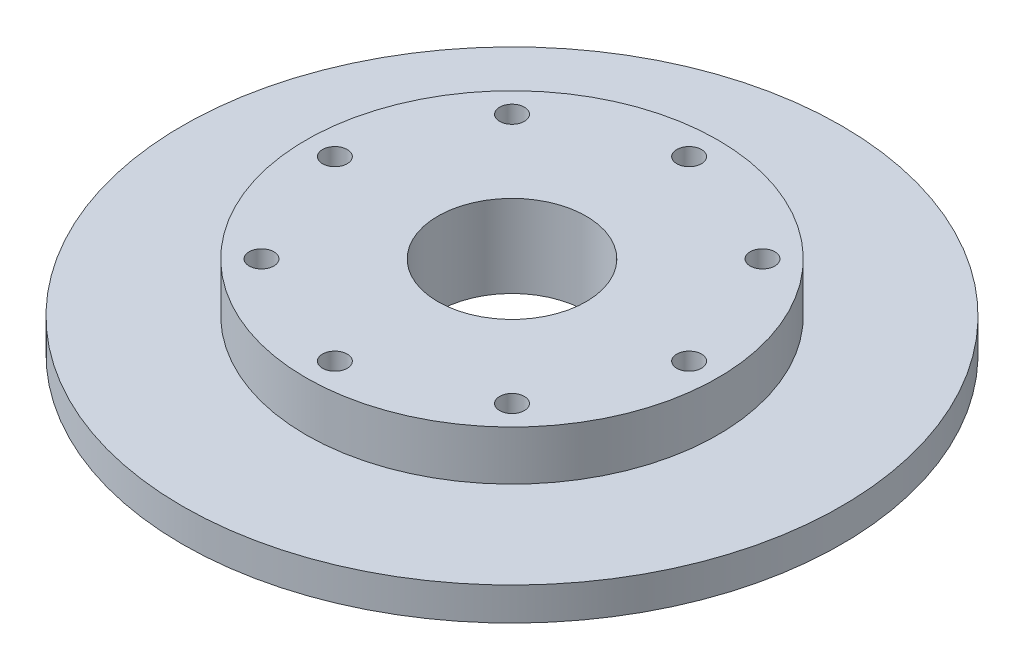
ISO-10303-21;
HEADER;
FILE_DESCRIPTION(('STEP AP214'),'2;1');
FILE_NAME('part.step','',(''),(''),'','','');
FILE_SCHEMA(('AUTOMOTIVE_DESIGN { 1 0 10303 214 1 1 1 1 }'));
ENDSEC;
DATA;
#1=APPLICATION_CONTEXT('core data for automotive mechanical design processes');
#2=APPLICATION_PROTOCOL_DEFINITION('international standard','automotive_design',2000,#1);
#3=PRODUCT_CONTEXT('',#1,'mechanical');
#4=PRODUCT('Part','Part','',(#3));
#5=PRODUCT_RELATED_PRODUCT_CATEGORY('part','',(#4));
#6=PRODUCT_DEFINITION_FORMATION('','',#4);
#7=PRODUCT_DEFINITION_CONTEXT('part definition',#1,'design');
#8=PRODUCT_DEFINITION('design','',#6,#7);
#9=PRODUCT_DEFINITION_SHAPE('','',#8);
#10=(LENGTH_UNIT() NAMED_UNIT(*) SI_UNIT(.MILLI.,.METRE.));
#11=(NAMED_UNIT(*) PLANE_ANGLE_UNIT() SI_UNIT($,.RADIAN.));
#12=(NAMED_UNIT(*) SI_UNIT($,.STERADIAN.) SOLID_ANGLE_UNIT());
#13=UNCERTAINTY_MEASURE_WITH_UNIT(LENGTH_MEASURE(1.E-05),#10,'distance_accuracy_value','');
#14=(GEOMETRIC_REPRESENTATION_CONTEXT(3) GLOBAL_UNCERTAINTY_ASSIGNED_CONTEXT((#13)) GLOBAL_UNIT_ASSIGNED_CONTEXT((#10,
#11,#12)) REPRESENTATION_CONTEXT('',''));
#15=CARTESIAN_POINT('',(0.,0.,0.));
#16=DIRECTION('',(0.,0.,1.));
#17=DIRECTION('',(1.,0.,0.));
#18=AXIS2_PLACEMENT_3D('',#15,#16,#17);
#19=CARTESIAN_POINT('',(15.2027957955109,5.,-15.2027957955106));
#20=DIRECTION('',(0.,1.,0.));
#21=DIRECTION('',(0.,0.,1.));
#22=AXIS2_PLACEMENT_3D('',#19,#20,#21);
#23=CYLINDRICAL_SURFACE('',#22,1.5);
#24=CARTESIAN_POINT('',(15.2027957955109,10.,-15.2027957955106));
#25=DIRECTION('',(0.,1.,0.));
#26=DIRECTION('',(0.,0.,1.));
#27=AXIS2_PLACEMENT_3D('',#24,#25,#26);
#28=CIRCLE('',#27,1.5);
#29=CARTESIAN_POINT('',(15.2027957955109,10.,-13.7027957955106));
#30=VERTEX_POINT('',#29);
#31=EDGE_CURVE('E133',#30,#30,#28,.T.);
#32=ORIENTED_EDGE('',*,*,#31,.T.);
#33=EDGE_LOOP('',(#32));
#34=FACE_BOUND('',#33,.T.);
#35=CARTESIAN_POINT('',(15.2027957955109,3.,-15.2027957955106));
#36=DIRECTION('',(0.,-1.,0.));
#37=DIRECTION('',(0.,0.,-1.));
#38=AXIS2_PLACEMENT_3D('',#35,#36,#37);
#39=CIRCLE('',#38,1.5);
#40=CARTESIAN_POINT('',(15.2027957955109,3.,-16.7027957955106));
#41=VERTEX_POINT('',#40);
#42=EDGE_CURVE('E43',#41,#41,#39,.F.);
#43=ORIENTED_EDGE('',*,*,#42,.F.);
#44=EDGE_LOOP('',(#43));
#45=FACE_BOUND('',#44,.T.);
#46=ADVANCED_FACE('F39',(#34,#45),#23,.F.);
#47=CARTESIAN_POINT('',(-15.2027957955108,5.,15.2027957955107));
#48=DIRECTION('',(0.,1.,0.));
#49=DIRECTION('',(0.,0.,1.));
#50=AXIS2_PLACEMENT_3D('',#47,#48,#49);
#51=CYLINDRICAL_SURFACE('',#50,1.5);
#52=CARTESIAN_POINT('',(-15.2027957955108,10.,15.2027957955107));
#53=DIRECTION('',(0.,1.,0.));
#54=DIRECTION('',(0.,0.,1.));
#55=AXIS2_PLACEMENT_3D('',#52,#53,#54);
#56=CIRCLE('',#55,1.5);
#57=CARTESIAN_POINT('',(-15.2027957955108,10.,16.7027957955107));
#58=VERTEX_POINT('',#57);
#59=EDGE_CURVE('E105',#58,#58,#56,.T.);
#60=ORIENTED_EDGE('',*,*,#59,.T.);
#61=EDGE_LOOP('',(#60));
#62=FACE_BOUND('',#61,.T.);
#63=CARTESIAN_POINT('',(-15.2027957955108,3.,15.2027957955107));
#64=DIRECTION('',(0.,-1.,0.));
#65=DIRECTION('',(0.,0.,-1.));
#66=AXIS2_PLACEMENT_3D('',#63,#64,#65);
#67=CIRCLE('',#66,1.5);
#68=CARTESIAN_POINT('',(-15.2027957955108,3.,13.7027957955107));
#69=VERTEX_POINT('',#68);
#70=EDGE_CURVE('E62',#69,#69,#67,.F.);
#71=ORIENTED_EDGE('',*,*,#70,.F.);
#72=EDGE_LOOP('',(#71));
#73=FACE_BOUND('',#72,.T.);
#74=ADVANCED_FACE('F174',(#62,#73),#51,.F.);
#75=CARTESIAN_POINT('',(0.,4.,0.));
#76=DIRECTION('',(0.,-1.,0.));
#77=DIRECTION('',(0.,0.,-1.));
#78=AXIS2_PLACEMENT_3D('',#75,#76,#77);
#79=CYLINDRICAL_SURFACE('',#78,40.);
#80=CARTESIAN_POINT('',(0.,4.,0.));
#81=DIRECTION('',(0.,1.,0.));
#82=DIRECTION('',(0.,0.,1.));
#83=AXIS2_PLACEMENT_3D('',#80,#81,#82);
#84=CIRCLE('',#83,40.);
#85=CARTESIAN_POINT('',(0.,4.,40.));
#86=VERTEX_POINT('',#85);
#87=EDGE_CURVE('E48',#86,#86,#84,.T.);
#88=ORIENTED_EDGE('',*,*,#87,.F.);
#89=EDGE_LOOP('',(#88));
#90=FACE_BOUND('',#89,.T.);
#91=CARTESIAN_POINT('',(0.,0.,0.));
#92=DIRECTION('',(0.,1.,0.));
#93=DIRECTION('',(0.,0.,1.));
#94=AXIS2_PLACEMENT_3D('',#91,#92,#93);
#95=CIRCLE('',#94,40.);
#96=CARTESIAN_POINT('',(0.,0.,40.));
#97=VERTEX_POINT('',#96);
#98=EDGE_CURVE('E54',#97,#97,#95,.T.);
#99=ORIENTED_EDGE('',*,*,#98,.T.);
#100=EDGE_LOOP('',(#99));
#101=FACE_BOUND('',#100,.T.);
#102=ADVANCED_FACE('F41',(#90,#101),#79,.T.);
#103=CARTESIAN_POINT('',(0.,4.,0.));
#104=DIRECTION('',(0.,1.,0.));
#105=DIRECTION('',(0.,0.,1.));
#106=AXIS2_PLACEMENT_3D('',#103,#104,#105);
#107=PLANE('',#106);
#108=CARTESIAN_POINT('',(0.,4.,0.));
#109=DIRECTION('',(0.,1.,0.));
#110=DIRECTION('',(0.,0.,1.));
#111=AXIS2_PLACEMENT_3D('',#108,#109,#110);
#112=CIRCLE('',#111,25.);
#113=CARTESIAN_POINT('',(0.,4.,25.));
#114=VERTEX_POINT('',#113);
#115=EDGE_CURVE('E10',#114,#114,#112,.T.);
#116=ORIENTED_EDGE('',*,*,#115,.F.);
#117=EDGE_LOOP('',(#116));
#118=FACE_BOUND('',#117,.T.);
#119=ORIENTED_EDGE('',*,*,#87,.T.);
#120=EDGE_LOOP('',(#119));
#121=FACE_BOUND('',#120,.T.);
#122=ADVANCED_FACE('F170',(#118,#121),#107,.T.);
#123=CARTESIAN_POINT('',(0.,0.,0.));
#124=DIRECTION('',(0.,1.,0.));
#125=DIRECTION('',(0.,0.,1.));
#126=AXIS2_PLACEMENT_3D('',#123,#124,#125);
#127=PLANE('',#126);
#128=CARTESIAN_POINT('',(-15.2027957955108,0.,15.2027957955107));
#129=DIRECTION('',(0.,-1.,0.));
#130=DIRECTION('',(0.,0.,-1.));
#131=AXIS2_PLACEMENT_3D('',#128,#129,#130);
#132=CIRCLE('',#131,2.84);
#133=CARTESIAN_POINT('',(-15.2027957955108,0.,12.3627957955107));
#134=VERTEX_POINT('',#133);
#135=EDGE_CURVE('E73',#134,#134,#132,.T.);
#136=ORIENTED_EDGE('',*,*,#135,.F.);
#137=EDGE_LOOP('',(#136));
#138=FACE_BOUND('',#137,.T.);
#139=CARTESIAN_POINT('',(15.2027957955109,0.,-15.2027957955106));
#140=DIRECTION('',(0.,-1.,0.));
#141=DIRECTION('',(0.,0.,-1.));
#142=AXIS2_PLACEMENT_3D('',#139,#140,#141);
#143=CIRCLE('',#142,2.84);
#144=CARTESIAN_POINT('',(15.2027957955109,0.,-18.0427957955106));
#145=VERTEX_POINT('',#144);
#146=EDGE_CURVE('E85',#145,#145,#143,.T.);
#147=ORIENTED_EDGE('',*,*,#146,.F.);
#148=EDGE_LOOP('',(#147));
#149=FACE_BOUND('',#148,.T.);
#150=CARTESIAN_POINT('',(0.,0.,0.));
#151=DIRECTION('',(0.,1.,0.));
#152=DIRECTION('',(0.,0.,1.));
#153=AXIS2_PLACEMENT_3D('',#150,#151,#152);
#154=CIRCLE('',#153,9.);
#155=CARTESIAN_POINT('',(0.,0.,9.));
#156=VERTEX_POINT('',#155);
#157=EDGE_CURVE('E89',#156,#156,#154,.T.);
#158=ORIENTED_EDGE('',*,*,#157,.T.);
#159=EDGE_LOOP('',(#158));
#160=FACE_BOUND('',#159,.T.);
#161=ORIENTED_EDGE('',*,*,#98,.F.);
#162=EDGE_LOOP('',(#161));
#163=FACE_BOUND('',#162,.T.);
#164=ADVANCED_FACE('F165',(#138,#149,#160,#163),#127,.F.);
#165=CARTESIAN_POINT('',(0.,10.,0.));
#166=DIRECTION('',(0.,-1.,0.));
#167=DIRECTION('',(0.,0.,-1.));
#168=AXIS2_PLACEMENT_3D('',#165,#166,#167);
#169=CYLINDRICAL_SURFACE('',#168,25.);
#170=CARTESIAN_POINT('',(0.,10.,0.));
#171=DIRECTION('',(0.,1.,0.));
#172=DIRECTION('',(0.,0.,1.));
#173=AXIS2_PLACEMENT_3D('',#170,#171,#172);
#174=CIRCLE('',#173,25.);
#175=CARTESIAN_POINT('',(0.,10.,25.));
#176=VERTEX_POINT('',#175);
#177=EDGE_CURVE('E57',#176,#176,#174,.T.);
#178=ORIENTED_EDGE('',*,*,#177,.F.);
#179=EDGE_LOOP('',(#178));
#180=FACE_BOUND('',#179,.T.);
#181=ORIENTED_EDGE('',*,*,#115,.T.);
#182=EDGE_LOOP('',(#181));
#183=FACE_BOUND('',#182,.T.);
#184=ADVANCED_FACE('F157',(#180,#183),#169,.T.);
#185=CARTESIAN_POINT('',(0.,10.,0.));
#186=DIRECTION('',(0.,1.,0.));
#187=DIRECTION('',(0.,0.,1.));
#188=AXIS2_PLACEMENT_3D('',#185,#186,#187);
#189=PLANE('',#188);
#190=CARTESIAN_POINT('',(0.,10.,0.));
#191=DIRECTION('',(0.,1.,0.));
#192=DIRECTION('',(0.,0.,1.));
#193=AXIS2_PLACEMENT_3D('',#190,#191,#192);
#194=CIRCLE('',#193,9.);
#195=CARTESIAN_POINT('',(0.,10.,9.));
#196=VERTEX_POINT('',#195);
#197=EDGE_CURVE('E71',#196,#196,#194,.T.);
#198=ORIENTED_EDGE('',*,*,#197,.F.);
#199=EDGE_LOOP('',(#198));
#200=FACE_BOUND('',#199,.T.);
#201=CARTESIAN_POINT('',(0.,10.,21.5));
#202=DIRECTION('',(0.,1.,0.));
#203=DIRECTION('',(0.,0.,1.));
#204=AXIS2_PLACEMENT_3D('',#201,#202,#203);
#205=CIRCLE('',#204,1.5);
#206=CARTESIAN_POINT('',(0.,10.,23.));
#207=VERTEX_POINT('',#206);
#208=EDGE_CURVE('E101',#207,#207,#205,.T.);
#209=ORIENTED_EDGE('',*,*,#208,.F.);
#210=EDGE_LOOP('',(#209));
#211=FACE_BOUND('',#210,.T.);
#212=ORIENTED_EDGE('',*,*,#59,.F.);
#213=EDGE_LOOP('',(#212));
#214=FACE_BOUND('',#213,.T.);
#215=CARTESIAN_POINT('',(-21.5,10.,0.));
#216=DIRECTION('',(0.,1.,0.));
#217=DIRECTION('',(0.,0.,1.));
#218=AXIS2_PLACEMENT_3D('',#215,#216,#217);
#219=CIRCLE('',#218,1.5);
#220=CARTESIAN_POINT('',(-21.5,10.,1.49999999999993));
#221=VERTEX_POINT('',#220);
#222=EDGE_CURVE('E113',#221,#221,#219,.T.);
#223=ORIENTED_EDGE('',*,*,#222,.F.);
#224=EDGE_LOOP('',(#223));
#225=FACE_BOUND('',#224,.T.);
#226=CARTESIAN_POINT('',(-15.2027957955107,10.,-15.2027957955108));
#227=DIRECTION('',(0.,1.,0.));
#228=DIRECTION('',(0.,0.,1.));
#229=AXIS2_PLACEMENT_3D('',#226,#227,#228);
#230=CIRCLE('',#229,1.5);
#231=CARTESIAN_POINT('',(-15.2027957955107,10.,-13.7027957955108));
#232=VERTEX_POINT('',#231);
#233=EDGE_CURVE('E121',#232,#232,#230,.T.);
#234=ORIENTED_EDGE('',*,*,#233,.F.);
#235=EDGE_LOOP('',(#234));
#236=FACE_BOUND('',#235,.T.);
#237=CARTESIAN_POINT('',(1.50133697570255E-13,10.,-21.5));
#238=DIRECTION('',(0.,1.,0.));
#239=DIRECTION('',(0.,0.,1.));
#240=AXIS2_PLACEMENT_3D('',#237,#238,#239);
#241=CIRCLE('',#240,1.5);
#242=CARTESIAN_POINT('',(1.50133697570255E-13,10.,-20.));
#243=VERTEX_POINT('',#242);
#244=EDGE_CURVE('E129',#243,#243,#241,.T.);
#245=ORIENTED_EDGE('',*,*,#244,.F.);
#246=EDGE_LOOP('',(#245));
#247=FACE_BOUND('',#246,.T.);
#248=ORIENTED_EDGE('',*,*,#31,.F.);
#249=EDGE_LOOP('',(#248));
#250=FACE_BOUND('',#249,.T.);
#251=CARTESIAN_POINT('',(21.5,10.,2.25200546355382E-13));
#252=DIRECTION('',(0.,1.,0.));
#253=DIRECTION('',(0.,0.,1.));
#254=AXIS2_PLACEMENT_3D('',#251,#252,#253);
#255=CIRCLE('',#254,1.5);
#256=CARTESIAN_POINT('',(21.5,10.,1.50000000000023));
#257=VERTEX_POINT('',#256);
#258=EDGE_CURVE('E141',#257,#257,#255,.T.);
#259=ORIENTED_EDGE('',*,*,#258,.F.);
#260=EDGE_LOOP('',(#259));
#261=FACE_BOUND('',#260,.T.);
#262=CARTESIAN_POINT('',(15.2027957955106,10.,15.202795795511));
#263=DIRECTION('',(0.,1.,0.));
#264=DIRECTION('',(0.,0.,1.));
#265=AXIS2_PLACEMENT_3D('',#262,#263,#264);
#266=CIRCLE('',#265,1.5);
#267=CARTESIAN_POINT('',(15.2027957955106,10.,16.702795795511));
#268=VERTEX_POINT('',#267);
#269=EDGE_CURVE('E93',#268,#268,#266,.T.);
#270=ORIENTED_EDGE('',*,*,#269,.F.);
#271=EDGE_LOOP('',(#270));
#272=FACE_BOUND('',#271,.T.);
#273=ORIENTED_EDGE('',*,*,#177,.T.);
#274=EDGE_LOOP('',(#273));
#275=FACE_BOUND('',#274,.T.);
#276=ADVANCED_FACE('F154',(#200,#211,#214,#225,#236,#247,#250,#261,#272,#275),#189,.T.);
#277=CARTESIAN_POINT('',(15.2027957955106,5.,15.202795795511));
#278=DIRECTION('',(0.,1.,0.));
#279=DIRECTION('',(0.,0.,1.));
#280=AXIS2_PLACEMENT_3D('',#277,#278,#279);
#281=CYLINDRICAL_SURFACE('',#280,1.5);
#282=CARTESIAN_POINT('',(15.2027957955106,5.,15.202795795511));
#283=DIRECTION('',(0.,1.,0.));
#284=DIRECTION('',(0.,0.,1.));
#285=AXIS2_PLACEMENT_3D('',#282,#283,#284);
#286=CIRCLE('',#285,1.5);
#287=CARTESIAN_POINT('',(15.2027957955106,5.,16.702795795511));
#288=VERTEX_POINT('',#287);
#289=EDGE_CURVE('E145',#288,#288,#286,.T.);
#290=ORIENTED_EDGE('',*,*,#289,.F.);
#291=EDGE_LOOP('',(#290));
#292=FACE_BOUND('',#291,.T.);
#293=ORIENTED_EDGE('',*,*,#269,.T.);
#294=EDGE_LOOP('',(#293));
#295=FACE_BOUND('',#294,.T.);
#296=ADVANCED_FACE('F152',(#292,#295),#281,.F.);
#297=CARTESIAN_POINT('',(15.2027957955106,5.,15.202795795511));
#298=DIRECTION('',(0.,1.,0.));
#299=DIRECTION('',(0.,0.,1.));
#300=AXIS2_PLACEMENT_3D('',#297,#298,#299);
#301=PLANE('',#300);
#302=ORIENTED_EDGE('',*,*,#289,.T.);
#303=EDGE_LOOP('',(#302));
#304=FACE_BOUND('',#303,.T.);
#305=ADVANCED_FACE('F194',(#304),#301,.T.);
#306=CARTESIAN_POINT('',(21.5,5.,2.25200546355382E-13));
#307=DIRECTION('',(0.,1.,0.));
#308=DIRECTION('',(0.,0.,1.));
#309=AXIS2_PLACEMENT_3D('',#306,#307,#308);
#310=CYLINDRICAL_SURFACE('',#309,1.5);
#311=CARTESIAN_POINT('',(21.5,5.,2.25200546355382E-13));
#312=DIRECTION('',(0.,1.,0.));
#313=DIRECTION('',(0.,0.,1.));
#314=AXIS2_PLACEMENT_3D('',#311,#312,#313);
#315=CIRCLE('',#314,1.5);
#316=CARTESIAN_POINT('',(21.5,5.,1.50000000000023));
#317=VERTEX_POINT('',#316);
#318=EDGE_CURVE('E137',#317,#317,#315,.T.);
#319=ORIENTED_EDGE('',*,*,#318,.F.);
#320=EDGE_LOOP('',(#319));
#321=FACE_BOUND('',#320,.T.);
#322=ORIENTED_EDGE('',*,*,#258,.T.);
#323=EDGE_LOOP('',(#322));
#324=FACE_BOUND('',#323,.T.);
#325=ADVANCED_FACE('F190',(#321,#324),#310,.F.);
#326=CARTESIAN_POINT('',(21.5,5.,2.25200546355382E-13));
#327=DIRECTION('',(0.,1.,0.));
#328=DIRECTION('',(0.,0.,1.));
#329=AXIS2_PLACEMENT_3D('',#326,#327,#328);
#330=PLANE('',#329);
#331=ORIENTED_EDGE('',*,*,#318,.T.);
#332=EDGE_LOOP('',(#331));
#333=FACE_BOUND('',#332,.T.);
#334=ADVANCED_FACE('F187',(#333),#330,.T.);
#335=CARTESIAN_POINT('',(1.50133697570255E-13,5.,-21.5));
#336=DIRECTION('',(0.,1.,0.));
#337=DIRECTION('',(0.,0.,1.));
#338=AXIS2_PLACEMENT_3D('',#335,#336,#337);
#339=CYLINDRICAL_SURFACE('',#338,1.5);
#340=CARTESIAN_POINT('',(1.50133697570255E-13,5.,-21.5));
#341=DIRECTION('',(0.,1.,0.));
#342=DIRECTION('',(0.,0.,1.));
#343=AXIS2_PLACEMENT_3D('',#340,#341,#342);
#344=CIRCLE('',#343,1.5);
#345=CARTESIAN_POINT('',(1.50133697570255E-13,5.,-20.));
#346=VERTEX_POINT('',#345);
#347=EDGE_CURVE('E125',#346,#346,#344,.T.);
#348=ORIENTED_EDGE('',*,*,#347,.F.);
#349=EDGE_LOOP('',(#348));
#350=FACE_BOUND('',#349,.T.);
#351=ORIENTED_EDGE('',*,*,#244,.T.);
#352=EDGE_LOOP('',(#351));
#353=FACE_BOUND('',#352,.T.);
#354=ADVANCED_FACE('F185',(#350,#353),#339,.F.);
#355=CARTESIAN_POINT('',(1.50133697570255E-13,5.,-21.5));
#356=DIRECTION('',(0.,1.,0.));
#357=DIRECTION('',(0.,0.,1.));
#358=AXIS2_PLACEMENT_3D('',#355,#356,#357);
#359=PLANE('',#358);
#360=ORIENTED_EDGE('',*,*,#347,.T.);
#361=EDGE_LOOP('',(#360));
#362=FACE_BOUND('',#361,.T.);
#363=ADVANCED_FACE('F224',(#362),#359,.T.);
#364=CARTESIAN_POINT('',(-15.2027957955107,5.,-15.2027957955108));
#365=DIRECTION('',(0.,1.,0.));
#366=DIRECTION('',(0.,0.,1.));
#367=AXIS2_PLACEMENT_3D('',#364,#365,#366);
#368=CYLINDRICAL_SURFACE('',#367,1.5);
#369=CARTESIAN_POINT('',(-15.2027957955107,5.,-15.2027957955108));
#370=DIRECTION('',(0.,1.,0.));
#371=DIRECTION('',(0.,0.,1.));
#372=AXIS2_PLACEMENT_3D('',#369,#370,#371);
#373=CIRCLE('',#372,1.5);
#374=CARTESIAN_POINT('',(-15.2027957955107,5.,-13.7027957955108));
#375=VERTEX_POINT('',#374);
#376=EDGE_CURVE('E117',#375,#375,#373,.T.);
#377=ORIENTED_EDGE('',*,*,#376,.F.);
#378=EDGE_LOOP('',(#377));
#379=FACE_BOUND('',#378,.T.);
#380=ORIENTED_EDGE('',*,*,#233,.T.);
#381=EDGE_LOOP('',(#380));
#382=FACE_BOUND('',#381,.T.);
#383=ADVANCED_FACE('F231',(#379,#382),#368,.F.);
#384=CARTESIAN_POINT('',(-15.2027957955107,5.,-15.2027957955108));
#385=DIRECTION('',(0.,1.,0.));
#386=DIRECTION('',(0.,0.,1.));
#387=AXIS2_PLACEMENT_3D('',#384,#385,#386);
#388=PLANE('',#387);
#389=ORIENTED_EDGE('',*,*,#376,.T.);
#390=EDGE_LOOP('',(#389));
#391=FACE_BOUND('',#390,.T.);
#392=ADVANCED_FACE('F238',(#391),#388,.T.);
#393=CARTESIAN_POINT('',(-21.5,5.,0.));
#394=DIRECTION('',(0.,1.,0.));
#395=DIRECTION('',(0.,0.,1.));
#396=AXIS2_PLACEMENT_3D('',#393,#394,#395);
#397=CYLINDRICAL_SURFACE('',#396,1.5);
#398=CARTESIAN_POINT('',(-21.5,5.,0.));
#399=DIRECTION('',(0.,1.,0.));
#400=DIRECTION('',(0.,0.,1.));
#401=AXIS2_PLACEMENT_3D('',#398,#399,#400);
#402=CIRCLE('',#401,1.5);
#403=CARTESIAN_POINT('',(-21.5,5.,1.49999999999993));
#404=VERTEX_POINT('',#403);
#405=EDGE_CURVE('E109',#404,#404,#402,.T.);
#406=ORIENTED_EDGE('',*,*,#405,.F.);
#407=EDGE_LOOP('',(#406));
#408=FACE_BOUND('',#407,.T.);
#409=ORIENTED_EDGE('',*,*,#222,.T.);
#410=EDGE_LOOP('',(#409));
#411=FACE_BOUND('',#410,.T.);
#412=ADVANCED_FACE('F246',(#408,#411),#397,.F.);
#413=CARTESIAN_POINT('',(-21.5,5.,0.));
#414=DIRECTION('',(0.,1.,0.));
#415=DIRECTION('',(0.,0.,1.));
#416=AXIS2_PLACEMENT_3D('',#413,#414,#415);
#417=PLANE('',#416);
#418=ORIENTED_EDGE('',*,*,#405,.T.);
#419=EDGE_LOOP('',(#418));
#420=FACE_BOUND('',#419,.T.);
#421=ADVANCED_FACE('F254',(#420),#417,.T.);
#422=CARTESIAN_POINT('',(0.,5.,21.5));
#423=DIRECTION('',(0.,1.,0.));
#424=DIRECTION('',(0.,0.,1.));
#425=AXIS2_PLACEMENT_3D('',#422,#423,#424);
#426=CYLINDRICAL_SURFACE('',#425,1.5);
#427=CARTESIAN_POINT('',(0.,5.,21.5));
#428=DIRECTION('',(0.,1.,0.));
#429=DIRECTION('',(0.,0.,1.));
#430=AXIS2_PLACEMENT_3D('',#427,#428,#429);
#431=CIRCLE('',#430,1.5);
#432=CARTESIAN_POINT('',(0.,5.,23.));
#433=VERTEX_POINT('',#432);
#434=EDGE_CURVE('E97',#433,#433,#431,.T.);
#435=ORIENTED_EDGE('',*,*,#434,.F.);
#436=EDGE_LOOP('',(#435));
#437=FACE_BOUND('',#436,.T.);
#438=ORIENTED_EDGE('',*,*,#208,.T.);
#439=EDGE_LOOP('',(#438));
#440=FACE_BOUND('',#439,.T.);
#441=ADVANCED_FACE('F262',(#437,#440),#426,.F.);
#442=CARTESIAN_POINT('',(0.,5.,21.5));
#443=DIRECTION('',(0.,1.,0.));
#444=DIRECTION('',(0.,0.,1.));
#445=AXIS2_PLACEMENT_3D('',#442,#443,#444);
#446=PLANE('',#445);
#447=ORIENTED_EDGE('',*,*,#434,.T.);
#448=EDGE_LOOP('',(#447));
#449=FACE_BOUND('',#448,.T.);
#450=ADVANCED_FACE('F270',(#449),#446,.T.);
#451=CARTESIAN_POINT('',(0.,0.,0.));
#452=DIRECTION('',(0.,1.,0.));
#453=DIRECTION('',(0.,0.,1.));
#454=AXIS2_PLACEMENT_3D('',#451,#452,#453);
#455=CYLINDRICAL_SURFACE('',#454,9.);
#456=ORIENTED_EDGE('',*,*,#157,.F.);
#457=EDGE_LOOP('',(#456));
#458=FACE_BOUND('',#457,.T.);
#459=ORIENTED_EDGE('',*,*,#197,.T.);
#460=EDGE_LOOP('',(#459));
#461=FACE_BOUND('',#460,.T.);
#462=ADVANCED_FACE('F278',(#458,#461),#455,.F.);
#463=CARTESIAN_POINT('',(-15.2027957955108,3.,15.2027957955107));
#464=DIRECTION('',(0.,-1.,0.));
#465=DIRECTION('',(0.,0.,-1.));
#466=AXIS2_PLACEMENT_3D('',#463,#464,#465);
#467=PLANE('',#466);
#468=CARTESIAN_POINT('',(-15.2027957955108,3.,15.2027957955107));
#469=DIRECTION('',(0.,-1.,0.));
#470=DIRECTION('',(0.,0.,-1.));
#471=AXIS2_PLACEMENT_3D('',#468,#469,#470);
#472=CIRCLE('',#471,2.84);
#473=CARTESIAN_POINT('',(-15.2027957955108,3.,12.3627957955107));
#474=VERTEX_POINT('',#473);
#475=EDGE_CURVE('E65',#474,#474,#472,.T.);
#476=ORIENTED_EDGE('',*,*,#475,.T.);
#477=EDGE_LOOP('',(#476));
#478=FACE_BOUND('',#477,.T.);
#479=ORIENTED_EDGE('',*,*,#70,.T.);
#480=EDGE_LOOP('',(#479));
#481=FACE_BOUND('',#480,.T.);
#482=ADVANCED_FACE('F286',(#478,#481),#467,.T.);
#483=CARTESIAN_POINT('',(-15.2027957955108,3.,15.2027957955107));
#484=DIRECTION('',(0.,-1.,0.));
#485=DIRECTION('',(0.,0.,-1.));
#486=AXIS2_PLACEMENT_3D('',#483,#484,#485);
#487=CYLINDRICAL_SURFACE('',#486,2.84);
#488=ORIENTED_EDGE('',*,*,#475,.F.);
#489=EDGE_LOOP('',(#488));
#490=FACE_BOUND('',#489,.T.);
#491=ORIENTED_EDGE('',*,*,#135,.T.);
#492=EDGE_LOOP('',(#491));
#493=FACE_BOUND('',#492,.T.);
#494=ADVANCED_FACE('F294',(#490,#493),#487,.F.);
#495=CARTESIAN_POINT('',(15.2027957955109,3.,-15.2027957955106));
#496=DIRECTION('',(0.,-1.,0.));
#497=DIRECTION('',(0.,0.,-1.));
#498=AXIS2_PLACEMENT_3D('',#495,#496,#497);
#499=PLANE('',#498);
#500=CARTESIAN_POINT('',(15.2027957955109,3.,-15.2027957955106));
#501=DIRECTION('',(0.,-1.,0.));
#502=DIRECTION('',(0.,0.,-1.));
#503=AXIS2_PLACEMENT_3D('',#500,#501,#502);
#504=CIRCLE('',#503,2.84);
#505=CARTESIAN_POINT('',(15.2027957955109,3.,-18.0427957955106));
#506=VERTEX_POINT('',#505);
#507=EDGE_CURVE('E79',#506,#506,#504,.T.);
#508=ORIENTED_EDGE('',*,*,#507,.T.);
#509=EDGE_LOOP('',(#508));
#510=FACE_BOUND('',#509,.T.);
#511=ORIENTED_EDGE('',*,*,#42,.T.);
#512=EDGE_LOOP('',(#511));
#513=FACE_BOUND('',#512,.T.);
#514=ADVANCED_FACE('F302',(#510,#513),#499,.T.);
#515=CARTESIAN_POINT('',(15.2027957955109,3.,-15.2027957955106));
#516=DIRECTION('',(0.,-1.,0.));
#517=DIRECTION('',(0.,0.,-1.));
#518=AXIS2_PLACEMENT_3D('',#515,#516,#517);
#519=CYLINDRICAL_SURFACE('',#518,2.84);
#520=ORIENTED_EDGE('',*,*,#507,.F.);
#521=EDGE_LOOP('',(#520));
#522=FACE_BOUND('',#521,.T.);
#523=ORIENTED_EDGE('',*,*,#146,.T.);
#524=EDGE_LOOP('',(#523));
#525=FACE_BOUND('',#524,.T.);
#526=ADVANCED_FACE('F310',(#522,#525),#519,.F.);
#527=CLOSED_SHELL('',(#46,#74,#102,#122,#164,#184,#276,#296,#305,#325,#334,#354,#363,#383,#392,
#412,#421,#441,#450,#462,#482,#494,#514,#526));
#528=MANIFOLD_SOLID_BREP('B2',#527);
#529=ADVANCED_BREP_SHAPE_REPRESENTATION('',(#18,#528),#14);
#530=SHAPE_DEFINITION_REPRESENTATION(#9,#529);
ENDSEC;
END-ISO-10303-21;
